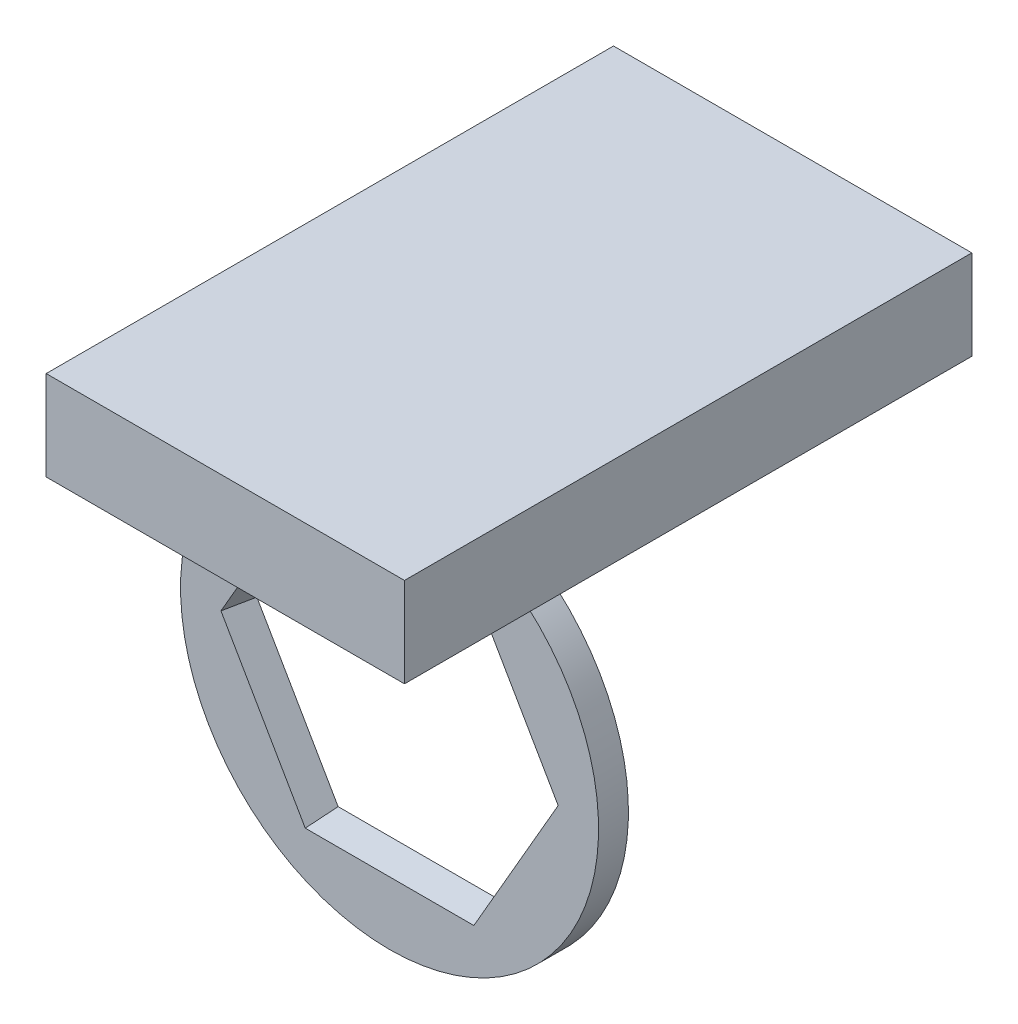
ISO-10303-21;
HEADER;
FILE_DESCRIPTION(('STEP AP214'),'2;1');
FILE_NAME('part.step','',(''),(''),'','','');
FILE_SCHEMA(('AUTOMOTIVE_DESIGN { 1 0 10303 214 1 1 1 1 }'));
ENDSEC;
DATA;
#1=APPLICATION_CONTEXT('core data for automotive mechanical design processes');
#2=APPLICATION_PROTOCOL_DEFINITION('international standard','automotive_design',2000,#1);
#3=PRODUCT_CONTEXT('',#1,'mechanical');
#4=PRODUCT('Part','Part','',(#3));
#5=PRODUCT_RELATED_PRODUCT_CATEGORY('part','',(#4));
#6=PRODUCT_DEFINITION_FORMATION('','',#4);
#7=PRODUCT_DEFINITION_CONTEXT('part definition',#1,'design');
#8=PRODUCT_DEFINITION('design','',#6,#7);
#9=PRODUCT_DEFINITION_SHAPE('','',#8);
#10=(LENGTH_UNIT() NAMED_UNIT(*) SI_UNIT(.MILLI.,.METRE.));
#11=(NAMED_UNIT(*) PLANE_ANGLE_UNIT() SI_UNIT($,.RADIAN.));
#12=(NAMED_UNIT(*) SI_UNIT($,.STERADIAN.) SOLID_ANGLE_UNIT());
#13=UNCERTAINTY_MEASURE_WITH_UNIT(LENGTH_MEASURE(1.E-05),#10,'distance_accuracy_value','');
#14=(GEOMETRIC_REPRESENTATION_CONTEXT(3) GLOBAL_UNCERTAINTY_ASSIGNED_CONTEXT((#13)) GLOBAL_UNIT_ASSIGNED_CONTEXT((#10,
#11,#12)) REPRESENTATION_CONTEXT('',''));
#15=CARTESIAN_POINT('',(0.,0.,0.));
#16=DIRECTION('',(0.,0.,1.));
#17=DIRECTION('',(1.,0.,0.));
#18=AXIS2_PLACEMENT_3D('',#15,#16,#17);
#19=CARTESIAN_POINT('',(0.,0.,10.));
#20=DIRECTION('',(0.,0.,1.));
#21=DIRECTION('',(1.,0.,0.));
#22=AXIS2_PLACEMENT_3D('',#19,#20,#21);
#23=PLANE('',#22);
#24=DIRECTION('',(0.5,0.866025403784439,0.));
#25=VECTOR('',#24,1.);
#26=CARTESIAN_POINT('',(42.3501877100401,-24.4508922746228,10.));
#27=LINE('',#26,#25);
#28=CARTESIAN_POINT('',(56.4669169467201,0.,10.));
#29=VERTEX_POINT('',#28);
#30=CARTESIAN_POINT('',(28.2334584733601,-48.9017845492457,10.));
#31=VERTEX_POINT('',#30);
#32=EDGE_CURVE('E233',#29,#31,#27,.F.);
#33=ORIENTED_EDGE('',*,*,#32,.T.);
#34=DIRECTION('',(1.,0.,0.));
#35=VECTOR('',#34,1.);
#36=CARTESIAN_POINT('',(0.,-48.9017845492457,10.));
#37=LINE('',#36,#35);
#38=CARTESIAN_POINT('',(-28.2334584733601,-48.9017845492457,10.));
#39=VERTEX_POINT('',#38);
#40=EDGE_CURVE('E236',#31,#39,#37,.F.);
#41=ORIENTED_EDGE('',*,*,#40,.T.);
#42=DIRECTION('',(0.5,-0.866025403784439,0.));
#43=VECTOR('',#42,1.);
#44=CARTESIAN_POINT('',(-42.3501877100401,-24.4508922746229,10.));
#45=LINE('',#44,#43);
#46=CARTESIAN_POINT('',(-56.4669169467202,0.,10.));
#47=VERTEX_POINT('',#46);
#48=EDGE_CURVE('E197',#39,#47,#45,.F.);
#49=ORIENTED_EDGE('',*,*,#48,.T.);
#50=DIRECTION('',(-0.5,-0.866025403784439,0.));
#51=VECTOR('',#50,1.);
#52=CARTESIAN_POINT('',(-42.3501877100401,24.4508922746228,10.));
#53=LINE('',#52,#51);
#54=CARTESIAN_POINT('',(-28.2334584733601,48.9017845492457,10.));
#55=VERTEX_POINT('',#54);
#56=EDGE_CURVE('E224',#47,#55,#53,.F.);
#57=ORIENTED_EDGE('',*,*,#56,.T.);
#58=DIRECTION('',(-1.,0.,0.));
#59=VECTOR('',#58,1.);
#60=CARTESIAN_POINT('',(0.,48.9017845492457,10.));
#61=LINE('',#60,#59);
#62=CARTESIAN_POINT('',(28.23345847336,48.9017845492457,10.));
#63=VERTEX_POINT('',#62);
#64=EDGE_CURVE('E227',#55,#63,#61,.F.);
#65=ORIENTED_EDGE('',*,*,#64,.T.);
#66=DIRECTION('',(-0.5,0.866025403784439,0.));
#67=VECTOR('',#66,1.);
#68=CARTESIAN_POINT('',(42.3501877100401,24.4508922746228,10.));
#69=LINE('',#68,#67);
#70=EDGE_CURVE('E230',#63,#29,#69,.F.);
#71=ORIENTED_EDGE('',*,*,#70,.T.);
#72=EDGE_LOOP('',(#33,#41,#49,#57,#65,#71));
#73=FACE_BOUND('',#72,.T.);
#74=CARTESIAN_POINT('',(0.,0.,10.));
#75=DIRECTION('',(0.,0.,1.));
#76=DIRECTION('',(1.,0.,0.));
#77=AXIS2_PLACEMENT_3D('',#74,#75,#76);
#78=CIRCLE('',#77,70.);
#79=CARTESIAN_POINT('',(-27.0373592808463,64.56764827,10.));
#80=VERTEX_POINT('',#79);
#81=CARTESIAN_POINT('',(27.0373592808463,64.56764827,10.));
#82=VERTEX_POINT('',#81);
#83=EDGE_CURVE('E193',#80,#82,#78,.T.);
#84=ORIENTED_EDGE('',*,*,#83,.T.);
#85=DIRECTION('',(-1.,0.,0.));
#86=VECTOR('',#85,1.);
#87=CARTESIAN_POINT('',(0.,64.56764827,10.));
#88=LINE('',#87,#86);
#89=EDGE_CURVE('E188',#82,#80,#88,.T.);
#90=ORIENTED_EDGE('',*,*,#89,.T.);
#91=EDGE_LOOP('',(#84,#90));
#92=FACE_BOUND('',#91,.T.);
#93=ADVANCED_FACE('F42',(#73,#92),#23,.T.);
#94=CARTESIAN_POINT('',(0.,0.,0.));
#95=DIRECTION('',(0.,0.,1.));
#96=DIRECTION('',(1.,0.,0.));
#97=AXIS2_PLACEMENT_3D('',#94,#95,#96);
#98=PLANE('',#97);
#99=DIRECTION('',(-0.5,-0.866025403784439,0.));
#100=VECTOR('',#99,1.);
#101=CARTESIAN_POINT('',(26.6386873402601,-48.1698533067575,0.));
#102=LINE('',#101,#100);
#103=CARTESIAN_POINT('',(27.2247825568707,-47.1547066135149,0.));
#104=VERTEX_POINT('',#103);
#105=CARTESIAN_POINT('',(54.4495651137413,0.,0.));
#106=VERTEX_POINT('',#105);
#107=EDGE_CURVE('E206',#104,#106,#102,.F.);
#108=ORIENTED_EDGE('',*,*,#107,.T.);
#109=DIRECTION('',(0.5,-0.866025403784439,0.));
#110=VECTOR('',#109,1.);
#111=CARTESIAN_POINT('',(55.0356603303519,-1.01514669324254,0.));
#112=LINE('',#111,#110);
#113=CARTESIAN_POINT('',(27.2247825568706,47.1547066135149,0.));
#114=VERTEX_POINT('',#113);
#115=EDGE_CURVE('E254',#106,#114,#112,.F.);
#116=ORIENTED_EDGE('',*,*,#115,.T.);
#117=DIRECTION('',(1.,0.,0.));
#118=VECTOR('',#117,1.);
#119=CARTESIAN_POINT('',(28.3969729900917,47.1547066135149,0.));
#120=LINE('',#119,#118);
#121=CARTESIAN_POINT('',(-27.2247825568707,47.1547066135149,0.));
#122=VERTEX_POINT('',#121);
#123=EDGE_CURVE('E246',#114,#122,#120,.F.);
#124=ORIENTED_EDGE('',*,*,#123,.T.);
#125=DIRECTION('',(0.5,0.866025403784439,0.));
#126=VECTOR('',#125,1.);
#127=CARTESIAN_POINT('',(-26.6386873402601,48.1698533067575,0.));
#128=LINE('',#127,#126);
#129=CARTESIAN_POINT('',(-54.4495651137413,0.,0.));
#130=VERTEX_POINT('',#129);
#131=EDGE_CURVE('E242',#122,#130,#128,.F.);
#132=ORIENTED_EDGE('',*,*,#131,.T.);
#133=DIRECTION('',(-0.5,0.866025403784439,0.));
#134=VECTOR('',#133,1.);
#135=CARTESIAN_POINT('',(-55.0356603303519,1.01514669324254,0.));
#136=LINE('',#135,#134);
#137=CARTESIAN_POINT('',(-27.2247825568707,-47.1547066135149,0.));
#138=VERTEX_POINT('',#137);
#139=EDGE_CURVE('E245',#130,#138,#136,.F.);
#140=ORIENTED_EDGE('',*,*,#139,.T.);
#141=DIRECTION('',(-1.,0.,0.));
#142=VECTOR('',#141,1.);
#143=CARTESIAN_POINT('',(-28.3969729900918,-47.1547066135149,0.));
#144=LINE('',#143,#142);
#145=EDGE_CURVE('E201',#138,#104,#144,.F.);
#146=ORIENTED_EDGE('',*,*,#145,.T.);
#147=EDGE_LOOP('',(#108,#116,#124,#132,#140,#146));
#148=FACE_BOUND('',#147,.T.);
#149=DIRECTION('',(-1.,0.,0.));
#150=VECTOR('',#149,1.);
#151=CARTESIAN_POINT('',(0.,64.56764827,0.));
#152=LINE('',#151,#150);
#153=CARTESIAN_POINT('',(27.0373592808463,64.56764827,0.));
#154=VERTEX_POINT('',#153);
#155=CARTESIAN_POINT('',(-27.0373592808463,64.56764827,0.));
#156=VERTEX_POINT('',#155);
#157=EDGE_CURVE('E63',#154,#156,#152,.T.);
#158=ORIENTED_EDGE('',*,*,#157,.F.);
#159=CARTESIAN_POINT('',(0.,0.,0.));
#160=DIRECTION('',(0.,0.,1.));
#161=DIRECTION('',(1.,0.,0.));
#162=AXIS2_PLACEMENT_3D('',#159,#160,#161);
#163=CIRCLE('',#162,70.);
#164=EDGE_CURVE('E198',#156,#154,#163,.T.);
#165=ORIENTED_EDGE('',*,*,#164,.F.);
#166=EDGE_LOOP('',(#158,#165));
#167=FACE_BOUND('',#166,.T.);
#168=ADVANCED_FACE('F263',(#148,#167),#98,.F.);
#169=CARTESIAN_POINT('',(0.,0.,10.));
#170=DIRECTION('',(0.,0.,-1.));
#171=DIRECTION('',(-1.,0.,0.));
#172=AXIS2_PLACEMENT_3D('',#169,#170,#171);
#173=CYLINDRICAL_SURFACE('',#172,70.);
#174=DIRECTION('',(0.,0.,-1.));
#175=VECTOR('',#174,1.);
#176=CARTESIAN_POINT('',(27.0373592808463,64.56764827,10.));
#177=LINE('',#176,#175);
#178=EDGE_CURVE('E12',#82,#154,#177,.T.);
#179=ORIENTED_EDGE('',*,*,#178,.F.);
#180=ORIENTED_EDGE('',*,*,#83,.F.);
#181=DIRECTION('',(0.,0.,-1.));
#182=VECTOR('',#181,1.);
#183=CARTESIAN_POINT('',(-27.0373592808463,64.56764827,10.));
#184=LINE('',#183,#182);
#185=EDGE_CURVE('E51',#156,#80,#184,.F.);
#186=ORIENTED_EDGE('',*,*,#185,.F.);
#187=ORIENTED_EDGE('',*,*,#164,.T.);
#188=EDGE_LOOP('',(#179,#180,#186,#187));
#189=FACE_BOUND('',#188,.T.);
#190=ADVANCED_FACE('F260',(#189),#173,.T.);
#191=CARTESIAN_POINT('',(28.3969729900917,47.2148413922759,0.344202038908106));
#192=DIRECTION('',(0.,0.985079303862055,-0.172101031672242));
#193=DIRECTION('',(-1.,0.,0.));
#194=AXIS2_PLACEMENT_3D('',#191,#192,#193);
#195=PLANE('',#194);
#196=DIRECTION('',(-0.0988756798636083,-0.171257701156683,-0.980252212303567));
#197=VECTOR('',#196,1.);
#198=CARTESIAN_POINT('',(27.2706217650287,47.2341024510234,0.454449317255394));
#199=LINE('',#198,#197);
#200=EDGE_CURVE('E207',#63,#114,#199,.T.);
#201=ORIENTED_EDGE('',*,*,#200,.F.);
#202=ORIENTED_EDGE('',*,*,#64,.F.);
#203=DIRECTION('',(-0.0988756798636074,0.171257701156684,0.980252212303567));
#204=VECTOR('',#203,1.);
#205=CARTESIAN_POINT('',(-26.7153814276582,46.272397976286,-5.05019621153814));
#206=LINE('',#205,#204);
#207=EDGE_CURVE('E202',#122,#55,#206,.T.);
#208=ORIENTED_EDGE('',*,*,#207,.F.);
#209=ORIENTED_EDGE('',*,*,#123,.F.);
#210=EDGE_LOOP('',(#201,#202,#208,#209));
#211=FACE_BOUND('',#210,.T.);
#212=ADVANCED_FACE('F276',(#211),#195,.F.);
#213=CARTESIAN_POINT('',(-26.6907655863181,48.199920696138,0.344202038908105));
#214=DIRECTION('',(-0.85310370188683,0.492539651931027,-0.172101031672242));
#215=DIRECTION('',(-0.5,-0.866025403784439,0.));
#216=AXIS2_PLACEMENT_3D('',#213,#214,#215);
#217=PLANE('',#216);
#218=ORIENTED_EDGE('',*,*,#207,.T.);
#219=ORIENTED_EDGE('',*,*,#56,.F.);
#220=DIRECTION('',(-0.197751359727215,0.,0.980252212303567));
#221=VECTOR('',#220,1.);
#222=CARTESIAN_POINT('',(-53.4307628553164,0.,-5.0501962115382));
#223=LINE('',#222,#221);
#224=EDGE_CURVE('E208',#130,#47,#223,.T.);
#225=ORIENTED_EDGE('',*,*,#224,.F.);
#226=ORIENTED_EDGE('',*,*,#131,.F.);
#227=EDGE_LOOP('',(#218,#219,#225,#226));
#228=FACE_BOUND('',#227,.T.);
#229=ADVANCED_FACE('F277',(#228),#217,.F.);
#230=CARTESIAN_POINT('',(55.0877385764098,-0.985079303862048,0.344202038908107));
#231=DIRECTION('',(0.853103701886829,0.492539651931027,-0.172101031672243));
#232=DIRECTION('',(-0.5,0.866025403784439,0.));
#233=AXIS2_PLACEMENT_3D('',#230,#231,#232);
#234=PLANE('',#233);
#235=ORIENTED_EDGE('',*,*,#200,.T.);
#236=ORIENTED_EDGE('',*,*,#115,.F.);
#237=DIRECTION('',(-0.197751359727216,0.,-0.980252212303567));
#238=VECTOR('',#237,1.);
#239=CARTESIAN_POINT('',(54.5412435300574,0.,0.454449317255394));
#240=LINE('',#239,#238);
#241=EDGE_CURVE('E212',#29,#106,#240,.T.);
#242=ORIENTED_EDGE('',*,*,#241,.F.);
#243=ORIENTED_EDGE('',*,*,#70,.F.);
#244=EDGE_LOOP('',(#235,#236,#242,#243));
#245=FACE_BOUND('',#244,.T.);
#246=ADVANCED_FACE('F280',(#245),#234,.F.);
#247=CARTESIAN_POINT('',(-55.0877385764099,0.985079303862048,0.344202038908107));
#248=DIRECTION('',(-0.853103701886829,-0.492539651931027,-0.172101031672243));
#249=DIRECTION('',(0.5,-0.866025403784439,0.));
#250=AXIS2_PLACEMENT_3D('',#247,#248,#249);
#251=PLANE('',#250);
#252=ORIENTED_EDGE('',*,*,#224,.T.);
#253=ORIENTED_EDGE('',*,*,#48,.F.);
#254=DIRECTION('',(-0.0988756798636085,-0.171257701156683,0.980252212303567));
#255=VECTOR('',#254,1.);
#256=CARTESIAN_POINT('',(-26.7153814276582,-46.272397976286,-5.05019621153812));
#257=LINE('',#256,#255);
#258=EDGE_CURVE('E219',#138,#39,#257,.T.);
#259=ORIENTED_EDGE('',*,*,#258,.F.);
#260=ORIENTED_EDGE('',*,*,#139,.F.);
#261=EDGE_LOOP('',(#252,#253,#259,#260));
#262=FACE_BOUND('',#261,.T.);
#263=ADVANCED_FACE('F44',(#262),#251,.F.);
#264=CARTESIAN_POINT('',(26.6907655863181,-48.199920696138,0.344202038908106));
#265=DIRECTION('',(0.85310370188683,-0.492539651931027,-0.172101031672242));
#266=DIRECTION('',(0.5,0.866025403784439,0.));
#267=AXIS2_PLACEMENT_3D('',#264,#265,#266);
#268=PLANE('',#267);
#269=ORIENTED_EDGE('',*,*,#241,.T.);
#270=ORIENTED_EDGE('',*,*,#107,.F.);
#271=DIRECTION('',(-0.0988756798636083,0.171257701156683,-0.980252212303567));
#272=VECTOR('',#271,1.);
#273=CARTESIAN_POINT('',(27.2706217650287,-47.2341024510234,0.454449317255393));
#274=LINE('',#273,#272);
#275=EDGE_CURVE('E192',#31,#104,#274,.T.);
#276=ORIENTED_EDGE('',*,*,#275,.F.);
#277=ORIENTED_EDGE('',*,*,#32,.F.);
#278=EDGE_LOOP('',(#269,#270,#276,#277));
#279=FACE_BOUND('',#278,.T.);
#280=ADVANCED_FACE('F288',(#279),#268,.F.);
#281=CARTESIAN_POINT('',(-28.3969729900918,-47.2148413922759,0.344202038908105));
#282=DIRECTION('',(0.,-0.985079303862055,-0.172101031672242));
#283=DIRECTION('',(1.,0.,0.));
#284=AXIS2_PLACEMENT_3D('',#281,#282,#283);
#285=PLANE('',#284);
#286=ORIENTED_EDGE('',*,*,#258,.T.);
#287=ORIENTED_EDGE('',*,*,#40,.F.);
#288=ORIENTED_EDGE('',*,*,#275,.T.);
#289=ORIENTED_EDGE('',*,*,#145,.F.);
#290=EDGE_LOOP('',(#286,#287,#288,#289));
#291=FACE_BOUND('',#290,.T.);
#292=ADVANCED_FACE('F290',(#291),#285,.F.);
#293=CARTESIAN_POINT('',(0.,64.56764827,0.));
#294=DIRECTION('',(0.,1.,0.));
#295=DIRECTION('',(0.,0.,1.));
#296=AXIS2_PLACEMENT_3D('',#293,#294,#295);
#297=PLANE('',#296);
#298=DIRECTION('',(0.,0.,1.));
#299=VECTOR('',#298,1.);
#300=CARTESIAN_POINT('',(-60.,64.56764827,-125.));
#301=LINE('',#300,#299);
#302=CARTESIAN_POINT('',(-60.,64.56764827,-125.));
#303=VERTEX_POINT('',#302);
#304=CARTESIAN_POINT('',(-60.,64.56764827,65.));
#305=VERTEX_POINT('',#304);
#306=EDGE_CURVE('E151',#303,#305,#301,.T.);
#307=ORIENTED_EDGE('',*,*,#306,.F.);
#308=DIRECTION('',(-1.,0.,0.));
#309=VECTOR('',#308,1.);
#310=CARTESIAN_POINT('',(-60.,64.56764827,-125.));
#311=LINE('',#310,#309);
#312=CARTESIAN_POINT('',(60.,64.56764827,-125.));
#313=VERTEX_POINT('',#312);
#314=EDGE_CURVE('E143',#313,#303,#311,.T.);
#315=ORIENTED_EDGE('',*,*,#314,.F.);
#316=DIRECTION('',(0.,0.,-1.));
#317=VECTOR('',#316,1.);
#318=CARTESIAN_POINT('',(60.,64.56764827,-125.));
#319=LINE('',#318,#317);
#320=CARTESIAN_POINT('',(60.,64.56764827,65.));
#321=VERTEX_POINT('',#320);
#322=EDGE_CURVE('E154',#321,#313,#319,.T.);
#323=ORIENTED_EDGE('',*,*,#322,.F.);
#324=DIRECTION('',(1.,0.,0.));
#325=VECTOR('',#324,1.);
#326=CARTESIAN_POINT('',(-60.,64.56764827,65.));
#327=LINE('',#326,#325);
#328=EDGE_CURVE('E134',#305,#321,#327,.T.);
#329=ORIENTED_EDGE('',*,*,#328,.F.);
#330=EDGE_LOOP('',(#307,#315,#323,#329));
#331=FACE_BOUND('',#330,.T.);
#332=ORIENTED_EDGE('',*,*,#89,.F.);
#333=ORIENTED_EDGE('',*,*,#178,.T.);
#334=ORIENTED_EDGE('',*,*,#157,.T.);
#335=ORIENTED_EDGE('',*,*,#185,.T.);
#336=EDGE_LOOP('',(#332,#333,#334,#335));
#337=FACE_BOUND('',#336,.T.);
#338=ADVANCED_FACE('F148',(#331,#337),#297,.F.);
#339=CARTESIAN_POINT('',(-60.,64.56764827,-125.));
#340=DIRECTION('',(-1.,0.,0.));
#341=DIRECTION('',(0.,0.,1.));
#342=AXIS2_PLACEMENT_3D('',#339,#340,#341);
#343=PLANE('',#342);
#344=DIRECTION('',(0.,0.,1.));
#345=VECTOR('',#344,1.);
#346=CARTESIAN_POINT('',(-60.,94.56764827,-125.));
#347=LINE('',#346,#345);
#348=CARTESIAN_POINT('',(-60.,94.56764827,-125.));
#349=VERTEX_POINT('',#348);
#350=CARTESIAN_POINT('',(-60.,94.56764827,65.));
#351=VERTEX_POINT('',#350);
#352=EDGE_CURVE('E171',#349,#351,#347,.T.);
#353=ORIENTED_EDGE('',*,*,#352,.F.);
#354=DIRECTION('',(0.,1.,0.));
#355=VECTOR('',#354,1.);
#356=CARTESIAN_POINT('',(-60.,64.56764827,-125.));
#357=LINE('',#356,#355);
#358=EDGE_CURVE('E158',#303,#349,#357,.T.);
#359=ORIENTED_EDGE('',*,*,#358,.F.);
#360=ORIENTED_EDGE('',*,*,#306,.T.);
#361=DIRECTION('',(0.,1.,0.));
#362=VECTOR('',#361,1.);
#363=CARTESIAN_POINT('',(-60.,64.56764827,65.));
#364=LINE('',#363,#362);
#365=EDGE_CURVE('E131',#305,#351,#364,.T.);
#366=ORIENTED_EDGE('',*,*,#365,.T.);
#367=EDGE_LOOP('',(#353,#359,#360,#366));
#368=FACE_BOUND('',#367,.T.);
#369=ADVANCED_FACE('F157',(#368),#343,.T.);
#370=CARTESIAN_POINT('',(-60.,64.56764827,-125.));
#371=DIRECTION('',(0.,0.,-1.));
#372=DIRECTION('',(-1.,0.,0.));
#373=AXIS2_PLACEMENT_3D('',#370,#371,#372);
#374=PLANE('',#373);
#375=DIRECTION('',(-1.,0.,0.));
#376=VECTOR('',#375,1.);
#377=CARTESIAN_POINT('',(-60.,94.56764827,-125.));
#378=LINE('',#377,#376);
#379=CARTESIAN_POINT('',(60.,94.56764827,-125.));
#380=VERTEX_POINT('',#379);
#381=EDGE_CURVE('E160',#380,#349,#378,.T.);
#382=ORIENTED_EDGE('',*,*,#381,.F.);
#383=DIRECTION('',(0.,1.,0.));
#384=VECTOR('',#383,1.);
#385=CARTESIAN_POINT('',(60.,64.56764827,-125.));
#386=LINE('',#385,#384);
#387=EDGE_CURVE('E181',#313,#380,#386,.T.);
#388=ORIENTED_EDGE('',*,*,#387,.F.);
#389=ORIENTED_EDGE('',*,*,#314,.T.);
#390=ORIENTED_EDGE('',*,*,#358,.T.);
#391=EDGE_LOOP('',(#382,#388,#389,#390));
#392=FACE_BOUND('',#391,.T.);
#393=ADVANCED_FACE('F361',(#392),#374,.T.);
#394=CARTESIAN_POINT('',(60.,64.56764827,-125.));
#395=DIRECTION('',(1.,0.,0.));
#396=DIRECTION('',(0.,0.,-1.));
#397=AXIS2_PLACEMENT_3D('',#394,#395,#396);
#398=PLANE('',#397);
#399=DIRECTION('',(0.,0.,-1.));
#400=VECTOR('',#399,1.);
#401=CARTESIAN_POINT('',(60.,94.56764827,-125.));
#402=LINE('',#401,#400);
#403=CARTESIAN_POINT('',(60.,94.56764827,65.));
#404=VERTEX_POINT('',#403);
#405=EDGE_CURVE('E164',#404,#380,#402,.T.);
#406=ORIENTED_EDGE('',*,*,#405,.F.);
#407=DIRECTION('',(0.,1.,0.));
#408=VECTOR('',#407,1.);
#409=CARTESIAN_POINT('',(60.,64.56764827,65.));
#410=LINE('',#409,#408);
#411=EDGE_CURVE('E142',#321,#404,#410,.T.);
#412=ORIENTED_EDGE('',*,*,#411,.F.);
#413=ORIENTED_EDGE('',*,*,#322,.T.);
#414=ORIENTED_EDGE('',*,*,#387,.T.);
#415=EDGE_LOOP('',(#406,#412,#413,#414));
#416=FACE_BOUND('',#415,.T.);
#417=ADVANCED_FACE('F369',(#416),#398,.T.);
#418=CARTESIAN_POINT('',(-60.,64.56764827,65.));
#419=DIRECTION('',(0.,0.,1.));
#420=DIRECTION('',(1.,0.,0.));
#421=AXIS2_PLACEMENT_3D('',#418,#419,#420);
#422=PLANE('',#421);
#423=DIRECTION('',(1.,0.,0.));
#424=VECTOR('',#423,1.);
#425=CARTESIAN_POINT('',(-60.,94.56764827,65.));
#426=LINE('',#425,#424);
#427=EDGE_CURVE('E136',#351,#404,#426,.T.);
#428=ORIENTED_EDGE('',*,*,#427,.F.);
#429=ORIENTED_EDGE('',*,*,#365,.F.);
#430=ORIENTED_EDGE('',*,*,#328,.T.);
#431=ORIENTED_EDGE('',*,*,#411,.T.);
#432=EDGE_LOOP('',(#428,#429,#430,#431));
#433=FACE_BOUND('',#432,.T.);
#434=ADVANCED_FACE('F133',(#433),#422,.T.);
#435=CARTESIAN_POINT('',(0.,94.56764827,0.));
#436=DIRECTION('',(0.,1.,0.));
#437=DIRECTION('',(0.,0.,1.));
#438=AXIS2_PLACEMENT_3D('',#435,#436,#437);
#439=PLANE('',#438);
#440=ORIENTED_EDGE('',*,*,#352,.T.);
#441=ORIENTED_EDGE('',*,*,#427,.T.);
#442=ORIENTED_EDGE('',*,*,#405,.T.);
#443=ORIENTED_EDGE('',*,*,#381,.T.);
#444=EDGE_LOOP('',(#440,#441,#442,#443));
#445=FACE_BOUND('',#444,.T.);
#446=ADVANCED_FACE('F388',(#445),#439,.T.);
#447=CLOSED_SHELL('',(#93,#168,#190,#212,#229,#246,#263,#280,#292,#338,#369,#393,#417,#434,#446));
#448=MANIFOLD_SOLID_BREP('B2',#447);
#449=ADVANCED_BREP_SHAPE_REPRESENTATION('',(#18,#448),#14);
#450=SHAPE_DEFINITION_REPRESENTATION(#9,#449);
ENDSEC;
END-ISO-10303-21;
